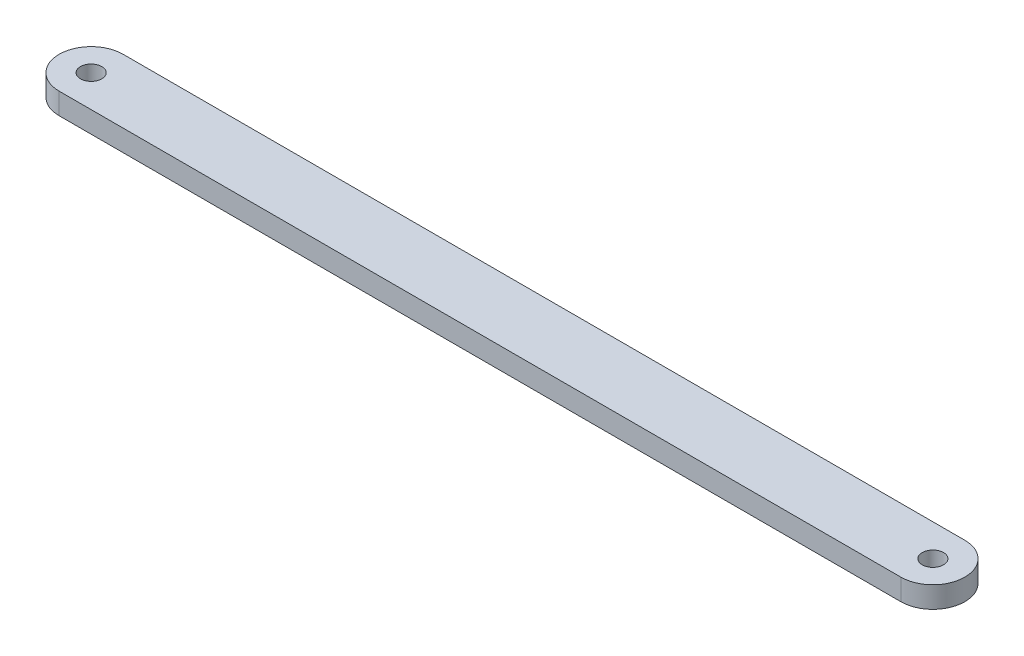
ISO-10303-21;
HEADER;
FILE_DESCRIPTION(('STEP AP214'),'2;1');
FILE_NAME('part.step','',(''),(''),'','','');
FILE_SCHEMA(('AUTOMOTIVE_DESIGN { 1 0 10303 214 1 1 1 1 }'));
ENDSEC;
DATA;
#1=APPLICATION_CONTEXT('core data for automotive mechanical design processes');
#2=APPLICATION_PROTOCOL_DEFINITION('international standard','automotive_design',2000,#1);
#3=PRODUCT_CONTEXT('',#1,'mechanical');
#4=PRODUCT('Part','Part','',(#3));
#5=PRODUCT_RELATED_PRODUCT_CATEGORY('part','',(#4));
#6=PRODUCT_DEFINITION_FORMATION('','',#4);
#7=PRODUCT_DEFINITION_CONTEXT('part definition',#1,'design');
#8=PRODUCT_DEFINITION('design','',#6,#7);
#9=PRODUCT_DEFINITION_SHAPE('','',#8);
#10=(LENGTH_UNIT() NAMED_UNIT(*) SI_UNIT(.MILLI.,.METRE.));
#11=(NAMED_UNIT(*) PLANE_ANGLE_UNIT() SI_UNIT($,.RADIAN.));
#12=(NAMED_UNIT(*) SI_UNIT($,.STERADIAN.) SOLID_ANGLE_UNIT());
#13=UNCERTAINTY_MEASURE_WITH_UNIT(LENGTH_MEASURE(1.E-05),#10,'distance_accuracy_value','');
#14=(GEOMETRIC_REPRESENTATION_CONTEXT(3) GLOBAL_UNCERTAINTY_ASSIGNED_CONTEXT((#13)) GLOBAL_UNIT_ASSIGNED_CONTEXT((#10,
#11,#12)) REPRESENTATION_CONTEXT('',''));
#15=CARTESIAN_POINT('',(0.,0.,0.));
#16=DIRECTION('',(0.,0.,1.));
#17=DIRECTION('',(1.,0.,0.));
#18=AXIS2_PLACEMENT_3D('',#15,#16,#17);
#19=CARTESIAN_POINT('',(-197.5,10.,0.));
#20=DIRECTION('',(0.,1.,0.));
#21=DIRECTION('',(0.,0.,1.));
#22=AXIS2_PLACEMENT_3D('',#19,#20,#21);
#23=PLANE('',#22);
#24=CARTESIAN_POINT('',(-197.5,10.,0.));
#25=DIRECTION('',(0.,1.,0.));
#26=DIRECTION('',(0.,0.,1.));
#27=AXIS2_PLACEMENT_3D('',#24,#25,#26);
#28=CIRCLE('',#27,4.99999999999999);
#29=CARTESIAN_POINT('',(-197.5,10.,4.99999999999999));
#30=VERTEX_POINT('',#29);
#31=EDGE_CURVE('E106',#30,#30,#28,.T.);
#32=ORIENTED_EDGE('',*,*,#31,.F.);
#33=EDGE_LOOP('',(#32));
#34=FACE_BOUND('',#33,.T.);
#35=CARTESIAN_POINT('',(-197.5,10.,0.));
#36=DIRECTION('',(0.,1.,0.));
#37=DIRECTION('',(0.,0.,1.));
#38=AXIS2_PLACEMENT_3D('',#35,#36,#37);
#39=CIRCLE('',#38,15.);
#40=CARTESIAN_POINT('',(-197.5,10.,-15.));
#41=VERTEX_POINT('',#40);
#42=CARTESIAN_POINT('',(-197.5,10.,15.));
#43=VERTEX_POINT('',#42);
#44=EDGE_CURVE('E91',#41,#43,#39,.T.);
#45=ORIENTED_EDGE('',*,*,#44,.T.);
#46=DIRECTION('',(1.,0.,0.));
#47=VECTOR('',#46,1.);
#48=CARTESIAN_POINT('',(-197.5,10.,15.));
#49=LINE('',#48,#47);
#50=CARTESIAN_POINT('',(197.5,10.,14.9999999999999));
#51=VERTEX_POINT('',#50);
#52=EDGE_CURVE('E86',#43,#51,#49,.T.);
#53=ORIENTED_EDGE('',*,*,#52,.T.);
#54=CARTESIAN_POINT('',(197.5,10.,0.));
#55=DIRECTION('',(0.,1.,0.));
#56=DIRECTION('',(0.,0.,1.));
#57=AXIS2_PLACEMENT_3D('',#54,#55,#56);
#58=CIRCLE('',#57,15.);
#59=CARTESIAN_POINT('',(197.5,10.,-15.));
#60=VERTEX_POINT('',#59);
#61=EDGE_CURVE('E89',#51,#60,#58,.T.);
#62=ORIENTED_EDGE('',*,*,#61,.T.);
#63=DIRECTION('',(-1.,0.,0.));
#64=VECTOR('',#63,1.);
#65=CARTESIAN_POINT('',(-197.5,10.,-15.));
#66=LINE('',#65,#64);
#67=EDGE_CURVE('E56',#60,#41,#66,.T.);
#68=ORIENTED_EDGE('',*,*,#67,.T.);
#69=EDGE_LOOP('',(#45,#53,#62,#68));
#70=FACE_BOUND('',#69,.T.);
#71=CARTESIAN_POINT('',(197.5,10.,0.));
#72=DIRECTION('',(0.,1.,0.));
#73=DIRECTION('',(0.,0.,1.));
#74=AXIS2_PLACEMENT_3D('',#71,#72,#73);
#75=CIRCLE('',#74,4.99999999999999);
#76=CARTESIAN_POINT('',(197.5,10.,4.99999999999992));
#77=VERTEX_POINT('',#76);
#78=EDGE_CURVE('E121',#77,#77,#75,.T.);
#79=ORIENTED_EDGE('',*,*,#78,.F.);
#80=EDGE_LOOP('',(#79));
#81=FACE_BOUND('',#80,.T.);
#82=ADVANCED_FACE('F39',(#34,#70,#81),#23,.T.);
#83=CARTESIAN_POINT('',(-197.5,0.,0.));
#84=DIRECTION('',(0.,1.,0.));
#85=DIRECTION('',(0.,0.,1.));
#86=AXIS2_PLACEMENT_3D('',#83,#84,#85);
#87=PLANE('',#86);
#88=CARTESIAN_POINT('',(-197.5,0.,0.));
#89=DIRECTION('',(0.,1.,0.));
#90=DIRECTION('',(0.,0.,1.));
#91=AXIS2_PLACEMENT_3D('',#88,#89,#90);
#92=CIRCLE('',#91,15.);
#93=CARTESIAN_POINT('',(-197.5,0.,-15.));
#94=VERTEX_POINT('',#93);
#95=CARTESIAN_POINT('',(-197.5,0.,15.));
#96=VERTEX_POINT('',#95);
#97=EDGE_CURVE('E103',#94,#96,#92,.T.);
#98=ORIENTED_EDGE('',*,*,#97,.F.);
#99=DIRECTION('',(-1.,0.,0.));
#100=VECTOR('',#99,1.);
#101=CARTESIAN_POINT('',(-197.5,0.,-15.));
#102=LINE('',#101,#100);
#103=CARTESIAN_POINT('',(197.5,0.,-15.));
#104=VERTEX_POINT('',#103);
#105=EDGE_CURVE('E79',#104,#94,#102,.T.);
#106=ORIENTED_EDGE('',*,*,#105,.F.);
#107=CARTESIAN_POINT('',(197.5,0.,0.));
#108=DIRECTION('',(0.,1.,0.));
#109=DIRECTION('',(0.,0.,1.));
#110=AXIS2_PLACEMENT_3D('',#107,#108,#109);
#111=CIRCLE('',#110,15.);
#112=CARTESIAN_POINT('',(197.5,0.,14.9999999999999));
#113=VERTEX_POINT('',#112);
#114=EDGE_CURVE('E73',#113,#104,#111,.T.);
#115=ORIENTED_EDGE('',*,*,#114,.F.);
#116=DIRECTION('',(1.,0.,0.));
#117=VECTOR('',#116,1.);
#118=CARTESIAN_POINT('',(-197.5,0.,15.));
#119=LINE('',#118,#117);
#120=EDGE_CURVE('E95',#96,#113,#119,.T.);
#121=ORIENTED_EDGE('',*,*,#120,.F.);
#122=EDGE_LOOP('',(#98,#106,#115,#121));
#123=FACE_BOUND('',#122,.T.);
#124=CARTESIAN_POINT('',(-197.5,0.,0.));
#125=DIRECTION('',(0.,1.,0.));
#126=DIRECTION('',(0.,0.,1.));
#127=AXIS2_PLACEMENT_3D('',#124,#125,#126);
#128=CIRCLE('',#127,4.99999999999999);
#129=CARTESIAN_POINT('',(-197.5,0.,4.99999999999999));
#130=VERTEX_POINT('',#129);
#131=EDGE_CURVE('E118',#130,#130,#128,.T.);
#132=ORIENTED_EDGE('',*,*,#131,.T.);
#133=EDGE_LOOP('',(#132));
#134=FACE_BOUND('',#133,.T.);
#135=CARTESIAN_POINT('',(197.5,0.,0.));
#136=DIRECTION('',(0.,1.,0.));
#137=DIRECTION('',(0.,0.,1.));
#138=AXIS2_PLACEMENT_3D('',#135,#136,#137);
#139=CIRCLE('',#138,4.99999999999999);
#140=CARTESIAN_POINT('',(197.5,0.,4.99999999999992));
#141=VERTEX_POINT('',#140);
#142=EDGE_CURVE('E124',#141,#141,#139,.T.);
#143=ORIENTED_EDGE('',*,*,#142,.T.);
#144=EDGE_LOOP('',(#143));
#145=FACE_BOUND('',#144,.T.);
#146=ADVANCED_FACE('F114',(#123,#134,#145),#87,.F.);
#147=CARTESIAN_POINT('',(-197.5,10.,0.));
#148=DIRECTION('',(0.,-1.,0.));
#149=DIRECTION('',(0.,0.,-1.));
#150=AXIS2_PLACEMENT_3D('',#147,#148,#149);
#151=CYLINDRICAL_SURFACE('',#150,15.);
#152=ORIENTED_EDGE('',*,*,#97,.T.);
#153=DIRECTION('',(0.,-1.,0.));
#154=VECTOR('',#153,1.);
#155=CARTESIAN_POINT('',(-197.5,10.,15.));
#156=LINE('',#155,#154);
#157=EDGE_CURVE('E11',#43,#96,#156,.T.);
#158=ORIENTED_EDGE('',*,*,#157,.F.);
#159=ORIENTED_EDGE('',*,*,#44,.F.);
#160=DIRECTION('',(0.,-1.,0.));
#161=VECTOR('',#160,1.);
#162=CARTESIAN_POINT('',(-197.5,10.,-15.));
#163=LINE('',#162,#161);
#164=EDGE_CURVE('E99',#41,#94,#163,.T.);
#165=ORIENTED_EDGE('',*,*,#164,.T.);
#166=EDGE_LOOP('',(#152,#158,#159,#165));
#167=FACE_BOUND('',#166,.T.);
#168=ADVANCED_FACE('F41',(#167),#151,.T.);
#169=CARTESIAN_POINT('',(-197.5,10.,15.));
#170=DIRECTION('',(0.,0.,-1.));
#171=DIRECTION('',(-1.,0.,0.));
#172=AXIS2_PLACEMENT_3D('',#169,#170,#171);
#173=PLANE('',#172);
#174=ORIENTED_EDGE('',*,*,#120,.T.);
#175=DIRECTION('',(0.,-1.,0.));
#176=VECTOR('',#175,1.);
#177=CARTESIAN_POINT('',(197.5,10.,14.9999999999999));
#178=LINE('',#177,#176);
#179=EDGE_CURVE('E48',#51,#113,#178,.T.);
#180=ORIENTED_EDGE('',*,*,#179,.F.);
#181=ORIENTED_EDGE('',*,*,#52,.F.);
#182=ORIENTED_EDGE('',*,*,#157,.T.);
#183=EDGE_LOOP('',(#174,#180,#181,#182));
#184=FACE_BOUND('',#183,.T.);
#185=ADVANCED_FACE('F94',(#184),#173,.F.);
#186=CARTESIAN_POINT('',(197.5,10.,0.));
#187=DIRECTION('',(0.,-1.,0.));
#188=DIRECTION('',(0.,0.,-1.));
#189=AXIS2_PLACEMENT_3D('',#186,#187,#188);
#190=CYLINDRICAL_SURFACE('',#189,15.);
#191=ORIENTED_EDGE('',*,*,#114,.T.);
#192=DIRECTION('',(0.,-1.,0.));
#193=VECTOR('',#192,1.);
#194=CARTESIAN_POINT('',(197.5,10.,-15.));
#195=LINE('',#194,#193);
#196=EDGE_CURVE('E96',#60,#104,#195,.T.);
#197=ORIENTED_EDGE('',*,*,#196,.F.);
#198=ORIENTED_EDGE('',*,*,#61,.F.);
#199=ORIENTED_EDGE('',*,*,#179,.T.);
#200=EDGE_LOOP('',(#191,#197,#198,#199));
#201=FACE_BOUND('',#200,.T.);
#202=ADVANCED_FACE('F97',(#201),#190,.T.);
#203=CARTESIAN_POINT('',(-197.5,10.,-15.));
#204=DIRECTION('',(0.,0.,1.));
#205=DIRECTION('',(1.,0.,0.));
#206=AXIS2_PLACEMENT_3D('',#203,#204,#205);
#207=PLANE('',#206);
#208=ORIENTED_EDGE('',*,*,#105,.T.);
#209=ORIENTED_EDGE('',*,*,#164,.F.);
#210=ORIENTED_EDGE('',*,*,#67,.F.);
#211=ORIENTED_EDGE('',*,*,#196,.T.);
#212=EDGE_LOOP('',(#208,#209,#210,#211));
#213=FACE_BOUND('',#212,.T.);
#214=ADVANCED_FACE('F111',(#213),#207,.F.);
#215=CARTESIAN_POINT('',(-197.5,10.,0.));
#216=DIRECTION('',(0.,-1.,0.));
#217=DIRECTION('',(0.,0.,-1.));
#218=AXIS2_PLACEMENT_3D('',#215,#216,#217);
#219=CYLINDRICAL_SURFACE('',#218,4.99999999999999);
#220=ORIENTED_EDGE('',*,*,#31,.T.);
#221=EDGE_LOOP('',(#220));
#222=FACE_BOUND('',#221,.T.);
#223=ORIENTED_EDGE('',*,*,#131,.F.);
#224=EDGE_LOOP('',(#223));
#225=FACE_BOUND('',#224,.T.);
#226=ADVANCED_FACE('F141',(#222,#225),#219,.F.);
#227=CARTESIAN_POINT('',(197.5,10.,0.));
#228=DIRECTION('',(0.,-1.,0.));
#229=DIRECTION('',(0.,0.,-1.));
#230=AXIS2_PLACEMENT_3D('',#227,#228,#229);
#231=CYLINDRICAL_SURFACE('',#230,4.99999999999999);
#232=ORIENTED_EDGE('',*,*,#78,.T.);
#233=EDGE_LOOP('',(#232));
#234=FACE_BOUND('',#233,.T.);
#235=ORIENTED_EDGE('',*,*,#142,.F.);
#236=EDGE_LOOP('',(#235));
#237=FACE_BOUND('',#236,.T.);
#238=ADVANCED_FACE('F130',(#234,#237),#231,.F.);
#239=CLOSED_SHELL('',(#82,#146,#168,#185,#202,#214,#226,#238));
#240=MANIFOLD_SOLID_BREP('B2',#239);
#241=ADVANCED_BREP_SHAPE_REPRESENTATION('',(#18,#240),#14);
#242=SHAPE_DEFINITION_REPRESENTATION(#9,#241);
ENDSEC;
END-ISO-10303-21;
